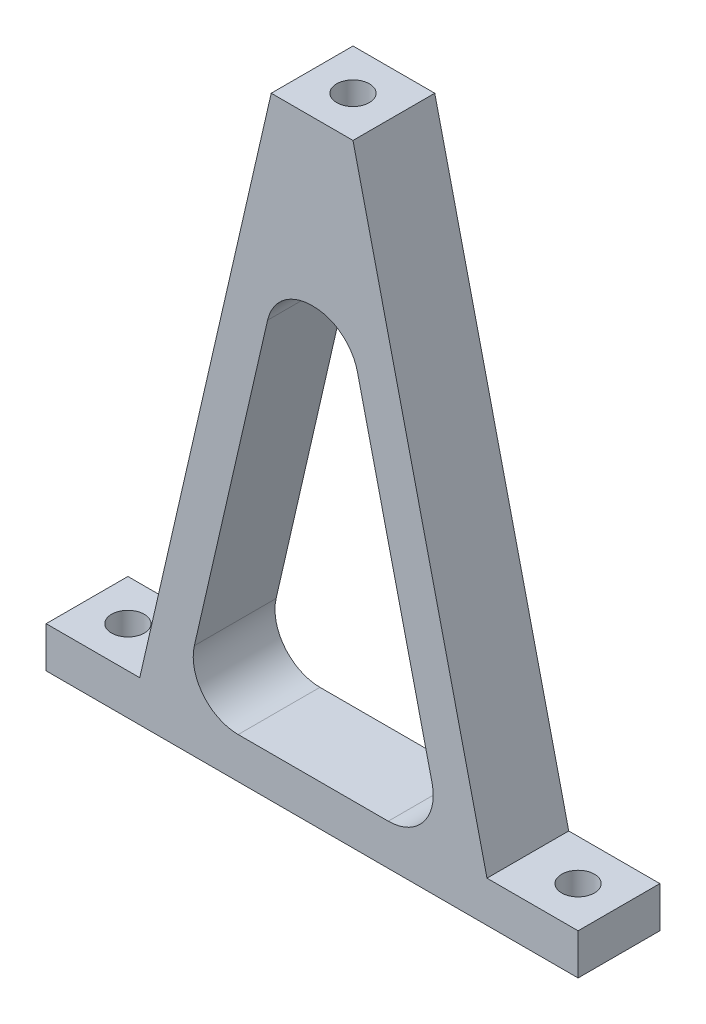
ISO-10303-21;
HEADER;
FILE_DESCRIPTION(('STEP AP214'),'2;1');
FILE_NAME('part.step','',(''),(''),'','','');
FILE_SCHEMA(('AUTOMOTIVE_DESIGN { 1 0 10303 214 1 1 1 1 }'));
ENDSEC;
DATA;
#1=APPLICATION_CONTEXT('core data for automotive mechanical design processes');
#2=APPLICATION_PROTOCOL_DEFINITION('international standard','automotive_design',2000,#1);
#3=PRODUCT_CONTEXT('',#1,'mechanical');
#4=PRODUCT('Part','Part','',(#3));
#5=PRODUCT_RELATED_PRODUCT_CATEGORY('part','',(#4));
#6=PRODUCT_DEFINITION_FORMATION('','',#4);
#7=PRODUCT_DEFINITION_CONTEXT('part definition',#1,'design');
#8=PRODUCT_DEFINITION('design','',#6,#7);
#9=PRODUCT_DEFINITION_SHAPE('','',#8);
#10=(LENGTH_UNIT() NAMED_UNIT(*) SI_UNIT(.MILLI.,.METRE.));
#11=(NAMED_UNIT(*) PLANE_ANGLE_UNIT() SI_UNIT($,.RADIAN.));
#12=(NAMED_UNIT(*) SI_UNIT($,.STERADIAN.) SOLID_ANGLE_UNIT());
#13=UNCERTAINTY_MEASURE_WITH_UNIT(LENGTH_MEASURE(1.E-05),#10,'distance_accuracy_value','');
#14=(GEOMETRIC_REPRESENTATION_CONTEXT(3) GLOBAL_UNCERTAINTY_ASSIGNED_CONTEXT((#13)) GLOBAL_UNIT_ASSIGNED_CONTEXT((#10,
#11,#12)) REPRESENTATION_CONTEXT('',''));
#15=CARTESIAN_POINT('',(0.,0.,0.));
#16=DIRECTION('',(0.,0.,1.));
#17=DIRECTION('',(1.,0.,0.));
#18=AXIS2_PLACEMENT_3D('',#15,#16,#17);
#19=CARTESIAN_POINT('',(-4.46772568231821,4.94396234763485,3.001));
#20=DIRECTION('',(0.,-1.,0.));
#21=DIRECTION('',(0.,0.,-1.));
#22=AXIS2_PLACEMENT_3D('',#19,#20,#21);
#23=PLANE('',#22);
#24=CARTESIAN_POINT('',(0.,4.94396234763485,-2.));
#25=DIRECTION('',(0.,-1.,0.));
#26=DIRECTION('',(0.,0.,-1.));
#27=AXIS2_PLACEMENT_3D('',#24,#25,#26);
#28=CIRCLE('',#27,2.);
#29=CARTESIAN_POINT('',(-0.0887346144552246,4.94396234763485,-0.00196942761190909));
#30=VERTEX_POINT('',#29);
#31=CARTESIAN_POINT('',(0.188894102782161,4.94396234763485,-0.00894022743310819));
#32=VERTEX_POINT('',#31);
#33=EDGE_CURVE('E159',#30,#32,#28,.F.);
#34=ORIENTED_EDGE('',*,*,#33,.T.);
#35=DIRECTION('',(0.,0.,-1.));
#36=VECTOR('',#35,1.);
#37=CARTESIAN_POINT('',(0.188894102782161,4.94396234763485,3.));
#38=LINE('',#37,#36);
#39=CARTESIAN_POINT('',(0.188894102782161,4.94396234763485,3.));
#40=VERTEX_POINT('',#39);
#41=EDGE_CURVE('E170',#32,#40,#38,.F.);
#42=ORIENTED_EDGE('',*,*,#41,.T.);
#43=DIRECTION('',(-1.,0.,0.));
#44=VECTOR('',#43,1.);
#45=CARTESIAN_POINT('',(-4.46772568231821,4.94396234763485,3.));
#46=LINE('',#45,#44);
#47=CARTESIAN_POINT('',(-0.0887346144552246,4.94396234763485,3.));
#48=VERTEX_POINT('',#47);
#49=EDGE_CURVE('E204',#40,#48,#46,.T.);
#50=ORIENTED_EDGE('',*,*,#49,.T.);
#51=DIRECTION('',(0.,0.,-1.));
#52=VECTOR('',#51,1.);
#53=CARTESIAN_POINT('',(-0.0887346144552246,4.94396234763485,-7.));
#54=LINE('',#53,#52);
#55=EDGE_CURVE('E173',#48,#30,#54,.T.);
#56=ORIENTED_EDGE('',*,*,#55,.T.);
#57=EDGE_LOOP('',(#34,#42,#50,#56));
#58=FACE_BOUND('',#57,.T.);
#59=ADVANCED_FACE('F35',(#58),#23,.T.);
#60=CARTESIAN_POINT('',(0.,0.,-7.));
#61=DIRECTION('',(0.,0.,1.));
#62=DIRECTION('',(1.,0.,0.));
#63=AXIS2_PLACEMENT_3D('',#60,#61,#62);
#64=PLANE('',#63);
#65=DIRECTION('',(0.228066186812437,-0.973645630829222,0.));
#66=VECTOR('',#65,1.);
#67=CARTESIAN_POINT('',(10.2788767532947,2.40771811797932,-7.));
#68=LINE('',#67,#66);
#69=CARTESIAN_POINT('',(5.,24.9439623476349,-7.));
#70=VERTEX_POINT('',#69);
#71=CARTESIAN_POINT('',(21.3836330982065,-45.,-7.));
#72=VERTEX_POINT('',#71);
#73=EDGE_CURVE('E263',#70,#72,#68,.T.);
#74=ORIENTED_EDGE('',*,*,#73,.T.);
#75=DIRECTION('',(1.,0.,0.));
#76=VECTOR('',#75,1.);
#77=CARTESIAN_POINT('',(0.,-45.,-7.));
#78=LINE('',#77,#76);
#79=CARTESIAN_POINT('',(32.5277614356054,-45.,-7.));
#80=VERTEX_POINT('',#79);
#81=EDGE_CURVE('E319',#72,#80,#78,.T.);
#82=ORIENTED_EDGE('',*,*,#81,.T.);
#83=DIRECTION('',(0.,-1.,0.));
#84=VECTOR('',#83,1.);
#85=CARTESIAN_POINT('',(32.5277614356054,0.,-7.));
#86=LINE('',#85,#84);
#87=CARTESIAN_POINT('',(32.5277614356054,-50.,-7.));
#88=VERTEX_POINT('',#87);
#89=EDGE_CURVE('E333',#80,#88,#86,.T.);
#90=ORIENTED_EDGE('',*,*,#89,.T.);
#91=DIRECTION('',(1.,0.,0.));
#92=VECTOR('',#91,1.);
#93=CARTESIAN_POINT('',(0.,-50.,-7.));
#94=LINE('',#93,#92);
#95=CARTESIAN_POINT('',(-32.5277614356054,-50.,-7.));
#96=VERTEX_POINT('',#95);
#97=EDGE_CURVE('E330',#96,#88,#94,.T.);
#98=ORIENTED_EDGE('',*,*,#97,.F.);
#99=DIRECTION('',(0.,-1.,0.));
#100=VECTOR('',#99,1.);
#101=CARTESIAN_POINT('',(-32.5277614356054,0.,-7.));
#102=LINE('',#101,#100);
#103=CARTESIAN_POINT('',(-32.5277614356054,-45.,-7.));
#104=VERTEX_POINT('',#103);
#105=EDGE_CURVE('E327',#104,#96,#102,.T.);
#106=ORIENTED_EDGE('',*,*,#105,.F.);
#107=CARTESIAN_POINT('',(-21.0807075183779,-45.,-7.));
#108=VERTEX_POINT('',#107);
#109=EDGE_CURVE('E324',#104,#108,#78,.T.);
#110=ORIENTED_EDGE('',*,*,#109,.T.);
#111=DIRECTION('',(-0.224062946507409,-0.974574674410544,0.));
#112=VECTOR('',#111,1.);
#113=CARTESIAN_POINT('',(-10.1958940864153,2.34412213990829,-7.));
#114=LINE('',#113,#112);
#115=CARTESIAN_POINT('',(-5.,24.9439623476349,-7.));
#116=VERTEX_POINT('',#115);
#117=EDGE_CURVE('E277',#116,#108,#114,.T.);
#118=ORIENTED_EDGE('',*,*,#117,.F.);
#119=DIRECTION('',(1.,0.,0.));
#120=VECTOR('',#119,1.);
#121=CARTESIAN_POINT('',(0.,24.9439623476349,-7.));
#122=LINE('',#121,#120);
#123=EDGE_CURVE('E251',#116,#70,#122,.T.);
#124=ORIENTED_EDGE('',*,*,#123,.T.);
#125=EDGE_LOOP('',(#74,#82,#90,#98,#106,#110,#118,#124));
#126=FACE_BOUND('',#125,.T.);
#127=DIRECTION('',(0.224062946507409,0.974574674410544,0.));
#128=VECTOR('',#127,1.);
#129=CARTESIAN_POINT('',(-4.46772568231821,4.94396234763485,-7.));
#130=LINE('',#129,#128);
#131=CARTESIAN_POINT('',(-14.4024410923454,-38.2676537942093,-7.));
#132=VERTEX_POINT('',#131);
#133=CARTESIAN_POINT('',(-5.44889532371322,0.676308553425599,-7.));
#134=VERTEX_POINT('',#133);
#135=EDGE_CURVE('E297',#132,#134,#130,.T.);
#136=ORIENTED_EDGE('',*,*,#135,.F.);
#137=CARTESIAN_POINT('',(-9.04228038308744,-39.5,-7.));
#138=DIRECTION('',(0.,0.,1.));
#139=DIRECTION('',(1.,0.,0.));
#140=AXIS2_PLACEMENT_3D('',#137,#138,#139);
#141=CIRCLE('',#140,5.5);
#142=CARTESIAN_POINT('',(-9.04228038308744,-45.,-7.));
#143=VERTEX_POINT('',#142);
#144=EDGE_CURVE('E192',#132,#143,#141,.T.);
#145=ORIENTED_EDGE('',*,*,#144,.T.);
#146=DIRECTION('',(-1.,0.,0.));
#147=VECTOR('',#146,1.);
#148=CARTESIAN_POINT('',(-15.9502643298924,-45.,-7.));
#149=LINE('',#148,#147);
#150=CARTESIAN_POINT('',(9.31110521405462,-45.,-7.));
#151=VERTEX_POINT('',#150);
#152=EDGE_CURVE('E300',#151,#143,#149,.T.);
#153=ORIENTED_EDGE('',*,*,#152,.F.);
#154=CARTESIAN_POINT('',(9.31110521405462,-39.5,-7.));
#155=DIRECTION('',(0.,0.,1.));
#156=DIRECTION('',(1.,0.,0.));
#157=AXIS2_PLACEMENT_3D('',#154,#155,#156);
#158=CIRCLE('',#157,5.5);
#159=CARTESIAN_POINT('',(14.6661561836153,-38.2456359725316,-7.));
#160=VERTEX_POINT('',#159);
#161=EDGE_CURVE('E188',#151,#160,#158,.T.);
#162=ORIENTED_EDGE('',*,*,#161,.T.);
#163=DIRECTION('',(0.228066186812437,-0.973645630829222,0.));
#164=VECTOR('',#163,1.);
#165=CARTESIAN_POINT('',(4.54944976913453,4.94396234763485,-7.));
#166=LINE('',#165,#164);
#167=CARTESIAN_POINT('',(5.54394507234289,0.698326375103257,-7.));
#168=VERTEX_POINT('',#167);
#169=EDGE_CURVE('E214',#168,#160,#166,.T.);
#170=ORIENTED_EDGE('',*,*,#169,.F.);
#171=CARTESIAN_POINT('',(0.188894102782161,-0.556037652365148,-7.));
#172=DIRECTION('',(0.,0.,1.));
#173=DIRECTION('',(1.,0.,0.));
#174=AXIS2_PLACEMENT_3D('',#171,#172,#173);
#175=CIRCLE('',#174,5.5);
#176=CARTESIAN_POINT('',(0.188894102782161,4.94396234763485,-7.));
#177=VERTEX_POINT('',#176);
#178=EDGE_CURVE('E43',#168,#177,#175,.T.);
#179=ORIENTED_EDGE('',*,*,#178,.T.);
#180=DIRECTION('',(1.,0.,0.));
#181=VECTOR('',#180,1.);
#182=CARTESIAN_POINT('',(-4.46772568231821,4.94396234763485,-7.));
#183=LINE('',#182,#181);
#184=CARTESIAN_POINT('',(-0.0887346144552246,4.94396234763485,-7.));
#185=VERTEX_POINT('',#184);
#186=EDGE_CURVE('E217',#185,#177,#183,.T.);
#187=ORIENTED_EDGE('',*,*,#186,.F.);
#188=CARTESIAN_POINT('',(-0.0887346144552246,-0.556037652365148,-7.));
#189=DIRECTION('',(0.,0.,1.));
#190=DIRECTION('',(1.,0.,0.));
#191=AXIS2_PLACEMENT_3D('',#188,#189,#190);
#192=CIRCLE('',#191,5.5);
#193=EDGE_CURVE('E196',#185,#134,#192,.T.);
#194=ORIENTED_EDGE('',*,*,#193,.T.);
#195=EDGE_LOOP('',(#136,#145,#153,#162,#170,#179,#187,#194));
#196=FACE_BOUND('',#195,.T.);
#197=ADVANCED_FACE('F298',(#126,#196),#64,.F.);
#198=CARTESIAN_POINT('',(0.,0.,3.));
#199=DIRECTION('',(0.,0.,1.));
#200=DIRECTION('',(1.,0.,0.));
#201=AXIS2_PLACEMENT_3D('',#198,#199,#200);
#202=PLANE('',#201);
#203=DIRECTION('',(0.228066186812437,-0.973645630829222,0.));
#204=VECTOR('',#203,1.);
#205=CARTESIAN_POINT('',(10.2788767532947,2.40771811797932,3.));
#206=LINE('',#205,#204);
#207=CARTESIAN_POINT('',(5.,24.9439623476349,3.));
#208=VERTEX_POINT('',#207);
#209=CARTESIAN_POINT('',(21.3836330982065,-45.,3.));
#210=VERTEX_POINT('',#209);
#211=EDGE_CURVE('E268',#208,#210,#206,.T.);
#212=ORIENTED_EDGE('',*,*,#211,.F.);
#213=DIRECTION('',(1.,0.,0.));
#214=VECTOR('',#213,1.);
#215=CARTESIAN_POINT('',(0.,24.9439623476349,3.));
#216=LINE('',#215,#214);
#217=CARTESIAN_POINT('',(-5.,24.9439623476349,3.));
#218=VERTEX_POINT('',#217);
#219=EDGE_CURVE('E250',#218,#208,#216,.T.);
#220=ORIENTED_EDGE('',*,*,#219,.F.);
#221=DIRECTION('',(-0.224062946507409,-0.974574674410544,0.));
#222=VECTOR('',#221,1.);
#223=CARTESIAN_POINT('',(-10.1958940864153,2.34412213990829,3.));
#224=LINE('',#223,#222);
#225=CARTESIAN_POINT('',(-21.0807075183779,-45.,3.));
#226=VERTEX_POINT('',#225);
#227=EDGE_CURVE('E260',#218,#226,#224,.T.);
#228=ORIENTED_EDGE('',*,*,#227,.T.);
#229=DIRECTION('',(1.,0.,0.));
#230=VECTOR('',#229,1.);
#231=CARTESIAN_POINT('',(0.,-45.,3.));
#232=LINE('',#231,#230);
#233=CARTESIAN_POINT('',(-32.5277614356054,-45.,3.));
#234=VERTEX_POINT('',#233);
#235=EDGE_CURVE('E337',#234,#226,#232,.T.);
#236=ORIENTED_EDGE('',*,*,#235,.F.);
#237=DIRECTION('',(0.,-1.,0.));
#238=VECTOR('',#237,1.);
#239=CARTESIAN_POINT('',(-32.5277614356054,0.,3.));
#240=LINE('',#239,#238);
#241=CARTESIAN_POINT('',(-32.5277614356054,-50.,3.));
#242=VERTEX_POINT('',#241);
#243=EDGE_CURVE('E339',#234,#242,#240,.T.);
#244=ORIENTED_EDGE('',*,*,#243,.T.);
#245=DIRECTION('',(1.,0.,0.));
#246=VECTOR('',#245,1.);
#247=CARTESIAN_POINT('',(0.,-50.,3.));
#248=LINE('',#247,#246);
#249=CARTESIAN_POINT('',(32.5277614356054,-50.,3.));
#250=VERTEX_POINT('',#249);
#251=EDGE_CURVE('E341',#242,#250,#248,.T.);
#252=ORIENTED_EDGE('',*,*,#251,.T.);
#253=DIRECTION('',(0.,-1.,0.));
#254=VECTOR('',#253,1.);
#255=CARTESIAN_POINT('',(32.5277614356054,0.,3.));
#256=LINE('',#255,#254);
#257=CARTESIAN_POINT('',(32.5277614356054,-45.,3.));
#258=VERTEX_POINT('',#257);
#259=EDGE_CURVE('E343',#258,#250,#256,.T.);
#260=ORIENTED_EDGE('',*,*,#259,.F.);
#261=EDGE_CURVE('E336',#210,#258,#232,.T.);
#262=ORIENTED_EDGE('',*,*,#261,.F.);
#263=EDGE_LOOP('',(#212,#220,#228,#236,#244,#252,#260,#262));
#264=FACE_BOUND('',#263,.T.);
#265=DIRECTION('',(1.,0.,0.));
#266=VECTOR('',#265,1.);
#267=CARTESIAN_POINT('',(-15.9502643298924,-45.,3.));
#268=LINE('',#267,#266);
#269=CARTESIAN_POINT('',(-9.04228038308744,-45.,3.));
#270=VERTEX_POINT('',#269);
#271=CARTESIAN_POINT('',(9.31110521405462,-45.,3.));
#272=VERTEX_POINT('',#271);
#273=EDGE_CURVE('E308',#270,#272,#268,.T.);
#274=ORIENTED_EDGE('',*,*,#273,.F.);
#275=CARTESIAN_POINT('',(-9.04228038308744,-39.5,3.));
#276=DIRECTION('',(0.,0.,1.));
#277=DIRECTION('',(1.,0.,0.));
#278=AXIS2_PLACEMENT_3D('',#275,#276,#277);
#279=CIRCLE('',#278,5.5);
#280=CARTESIAN_POINT('',(-14.4024410923454,-38.2676537942093,3.));
#281=VERTEX_POINT('',#280);
#282=EDGE_CURVE('E194',#270,#281,#279,.F.);
#283=ORIENTED_EDGE('',*,*,#282,.T.);
#284=DIRECTION('',(-0.224062946507409,-0.974574674410544,0.));
#285=VECTOR('',#284,1.);
#286=CARTESIAN_POINT('',(-4.46772568231821,4.94396234763485,3.));
#287=LINE('',#286,#285);
#288=CARTESIAN_POINT('',(-5.44889532371322,0.676308553425598,3.));
#289=VERTEX_POINT('',#288);
#290=EDGE_CURVE('E206',#289,#281,#287,.T.);
#291=ORIENTED_EDGE('',*,*,#290,.F.);
#292=CARTESIAN_POINT('',(-0.0887346144552246,-0.556037652365148,3.));
#293=DIRECTION('',(0.,0.,1.));
#294=DIRECTION('',(1.,0.,0.));
#295=AXIS2_PLACEMENT_3D('',#292,#293,#294);
#296=CIRCLE('',#295,5.5);
#297=EDGE_CURVE('E198',#289,#48,#296,.F.);
#298=ORIENTED_EDGE('',*,*,#297,.T.);
#299=ORIENTED_EDGE('',*,*,#49,.F.);
#300=CARTESIAN_POINT('',(0.188894102782161,-0.556037652365148,3.));
#301=DIRECTION('',(0.,0.,1.));
#302=DIRECTION('',(1.,0.,0.));
#303=AXIS2_PLACEMENT_3D('',#300,#301,#302);
#304=CIRCLE('',#303,5.5);
#305=CARTESIAN_POINT('',(5.54394507234289,0.698326375103256,3.));
#306=VERTEX_POINT('',#305);
#307=EDGE_CURVE('E11',#40,#306,#304,.F.);
#308=ORIENTED_EDGE('',*,*,#307,.T.);
#309=DIRECTION('',(-0.228066186812437,0.973645630829223,0.));
#310=VECTOR('',#309,1.);
#311=CARTESIAN_POINT('',(4.54944976913453,4.94396234763485,3.));
#312=LINE('',#311,#310);
#313=CARTESIAN_POINT('',(14.6661561836153,-38.2456359725316,3.));
#314=VERTEX_POINT('',#313);
#315=EDGE_CURVE('E305',#314,#306,#312,.T.);
#316=ORIENTED_EDGE('',*,*,#315,.F.);
#317=CARTESIAN_POINT('',(9.31110521405462,-39.5,3.));
#318=DIRECTION('',(0.,0.,1.));
#319=DIRECTION('',(1.,0.,0.));
#320=AXIS2_PLACEMENT_3D('',#317,#318,#319);
#321=CIRCLE('',#320,5.5);
#322=EDGE_CURVE('E190',#314,#272,#321,.F.);
#323=ORIENTED_EDGE('',*,*,#322,.T.);
#324=EDGE_LOOP('',(#274,#283,#291,#298,#299,#308,#316,#323));
#325=FACE_BOUND('',#324,.T.);
#326=ADVANCED_FACE('F203',(#264,#325),#202,.T.);
#327=CARTESIAN_POINT('',(10.2788767532947,2.40771811797932,-7.));
#328=DIRECTION('',(-0.973645630829222,-0.228066186812437,0.));
#329=DIRECTION('',(0.228066186812437,-0.973645630829222,0.));
#330=AXIS2_PLACEMENT_3D('',#327,#328,#329);
#331=PLANE('',#330);
#332=DIRECTION('',(0.,0.,1.));
#333=VECTOR('',#332,1.);
#334=CARTESIAN_POINT('',(5.,24.9439623476349,-7.));
#335=LINE('',#334,#333);
#336=EDGE_CURVE('E256',#70,#208,#335,.T.);
#337=ORIENTED_EDGE('',*,*,#336,.T.);
#338=ORIENTED_EDGE('',*,*,#211,.T.);
#339=DIRECTION('',(0.,0.,1.));
#340=VECTOR('',#339,1.);
#341=CARTESIAN_POINT('',(21.3836330982065,-45.,-7.));
#342=LINE('',#341,#340);
#343=EDGE_CURVE('E279',#72,#210,#342,.T.);
#344=ORIENTED_EDGE('',*,*,#343,.F.);
#345=ORIENTED_EDGE('',*,*,#73,.F.);
#346=EDGE_LOOP('',(#337,#338,#344,#345));
#347=FACE_BOUND('',#346,.T.);
#348=ADVANCED_FACE('F375',(#347),#331,.F.);
#349=CARTESIAN_POINT('',(-10.1958940864153,2.34412213990829,-7.));
#350=DIRECTION('',(-0.974574674410544,0.224062946507409,0.));
#351=DIRECTION('',(-0.224062946507409,-0.974574674410544,0.));
#352=AXIS2_PLACEMENT_3D('',#349,#350,#351);
#353=PLANE('',#352);
#354=DIRECTION('',(0.,0.,1.));
#355=VECTOR('',#354,1.);
#356=CARTESIAN_POINT('',(-21.0807075183779,-45.,-7.));
#357=LINE('',#356,#355);
#358=EDGE_CURVE('E255',#108,#226,#357,.T.);
#359=ORIENTED_EDGE('',*,*,#358,.T.);
#360=ORIENTED_EDGE('',*,*,#227,.F.);
#361=DIRECTION('',(0.,0.,1.));
#362=VECTOR('',#361,1.);
#363=CARTESIAN_POINT('',(-5.,24.9439623476349,-7.));
#364=LINE('',#363,#362);
#365=EDGE_CURVE('E246',#116,#218,#364,.T.);
#366=ORIENTED_EDGE('',*,*,#365,.F.);
#367=ORIENTED_EDGE('',*,*,#117,.T.);
#368=EDGE_LOOP('',(#359,#360,#366,#367));
#369=FACE_BOUND('',#368,.T.);
#370=ADVANCED_FACE('F242',(#369),#353,.T.);
#371=CARTESIAN_POINT('',(0.,24.9439623476349,-7.));
#372=DIRECTION('',(0.,-1.,0.));
#373=DIRECTION('',(0.,0.,-1.));
#374=AXIS2_PLACEMENT_3D('',#371,#372,#373);
#375=PLANE('',#374);
#376=CARTESIAN_POINT('',(0.,24.9439623476349,-2.));
#377=DIRECTION('',(0.,1.,0.));
#378=DIRECTION('',(0.,0.,1.));
#379=AXIS2_PLACEMENT_3D('',#376,#377,#378);
#380=CIRCLE('',#379,2.);
#381=CARTESIAN_POINT('',(0.,24.9439623476349,0.));
#382=VERTEX_POINT('',#381);
#383=EDGE_CURVE('E165',#382,#382,#380,.T.);
#384=ORIENTED_EDGE('',*,*,#383,.F.);
#385=EDGE_LOOP('',(#384));
#386=FACE_BOUND('',#385,.T.);
#387=ORIENTED_EDGE('',*,*,#365,.T.);
#388=ORIENTED_EDGE('',*,*,#219,.T.);
#389=ORIENTED_EDGE('',*,*,#336,.F.);
#390=ORIENTED_EDGE('',*,*,#123,.F.);
#391=EDGE_LOOP('',(#387,#388,#389,#390));
#392=FACE_BOUND('',#391,.T.);
#393=ADVANCED_FACE('F238',(#386,#392),#375,.F.);
#394=CARTESIAN_POINT('',(0.,-45.,3.));
#395=DIRECTION('',(0.,1.,0.));
#396=DIRECTION('',(0.,0.,1.));
#397=AXIS2_PLACEMENT_3D('',#394,#395,#396);
#398=PLANE('',#397);
#399=CARTESIAN_POINT('',(-27.5277614356054,-45.,-2.));
#400=DIRECTION('',(0.,1.,0.));
#401=DIRECTION('',(0.,0.,1.));
#402=AXIS2_PLACEMENT_3D('',#399,#400,#401);
#403=CIRCLE('',#402,2.);
#404=CARTESIAN_POINT('',(-27.5277614356054,-45.,0.));
#405=VERTEX_POINT('',#404);
#406=EDGE_CURVE('E312',#405,#405,#403,.T.);
#407=ORIENTED_EDGE('',*,*,#406,.F.);
#408=EDGE_LOOP('',(#407));
#409=FACE_BOUND('',#408,.T.);
#410=ORIENTED_EDGE('',*,*,#358,.F.);
#411=ORIENTED_EDGE('',*,*,#109,.F.);
#412=DIRECTION('',(0.,0.,-1.));
#413=VECTOR('',#412,1.);
#414=CARTESIAN_POINT('',(-32.5277614356054,-45.,3.));
#415=LINE('',#414,#413);
#416=EDGE_CURVE('E270',#234,#104,#415,.T.);
#417=ORIENTED_EDGE('',*,*,#416,.F.);
#418=ORIENTED_EDGE('',*,*,#235,.T.);
#419=EDGE_LOOP('',(#410,#411,#417,#418));
#420=FACE_BOUND('',#419,.T.);
#421=ADVANCED_FACE('F241',(#409,#420),#398,.T.);
#422=CARTESIAN_POINT('',(27.5277614356054,-45.,-2.));
#423=DIRECTION('',(0.,1.,0.));
#424=DIRECTION('',(0.,0.,1.));
#425=AXIS2_PLACEMENT_3D('',#422,#423,#424);
#426=CIRCLE('',#425,2.);
#427=CARTESIAN_POINT('',(27.5277614356054,-45.,0.));
#428=VERTEX_POINT('',#427);
#429=EDGE_CURVE('E209',#428,#428,#426,.T.);
#430=ORIENTED_EDGE('',*,*,#429,.F.);
#431=EDGE_LOOP('',(#430));
#432=FACE_BOUND('',#431,.T.);
#433=ORIENTED_EDGE('',*,*,#81,.F.);
#434=ORIENTED_EDGE('',*,*,#343,.T.);
#435=ORIENTED_EDGE('',*,*,#261,.T.);
#436=DIRECTION('',(0.,0.,-1.));
#437=VECTOR('',#436,1.);
#438=CARTESIAN_POINT('',(32.5277614356054,-45.,3.));
#439=LINE('',#438,#437);
#440=EDGE_CURVE('E346',#258,#80,#439,.T.);
#441=ORIENTED_EDGE('',*,*,#440,.T.);
#442=EDGE_LOOP('',(#433,#434,#435,#441));
#443=FACE_BOUND('',#442,.T.);
#444=ADVANCED_FACE('F371',(#432,#443),#398,.T.);
#445=CARTESIAN_POINT('',(-32.5277614356054,0.,3.));
#446=DIRECTION('',(1.,0.,0.));
#447=DIRECTION('',(0.,0.,-1.));
#448=AXIS2_PLACEMENT_3D('',#445,#446,#447);
#449=PLANE('',#448);
#450=ORIENTED_EDGE('',*,*,#416,.T.);
#451=ORIENTED_EDGE('',*,*,#105,.T.);
#452=DIRECTION('',(0.,0.,-1.));
#453=VECTOR('',#452,1.);
#454=CARTESIAN_POINT('',(-32.5277614356054,-50.,3.));
#455=LINE('',#454,#453);
#456=EDGE_CURVE('E351',#242,#96,#455,.T.);
#457=ORIENTED_EDGE('',*,*,#456,.F.);
#458=ORIENTED_EDGE('',*,*,#243,.F.);
#459=EDGE_LOOP('',(#450,#451,#457,#458));
#460=FACE_BOUND('',#459,.T.);
#461=ADVANCED_FACE('F355',(#460),#449,.F.);
#462=CARTESIAN_POINT('',(0.,-50.,3.));
#463=DIRECTION('',(0.,1.,0.));
#464=DIRECTION('',(0.,0.,1.));
#465=AXIS2_PLACEMENT_3D('',#462,#463,#464);
#466=PLANE('',#465);
#467=CARTESIAN_POINT('',(-27.5277614356054,-50.,-2.));
#468=DIRECTION('',(0.,1.,0.));
#469=DIRECTION('',(0.,0.,1.));
#470=AXIS2_PLACEMENT_3D('',#467,#468,#469);
#471=CIRCLE('',#470,2.);
#472=CARTESIAN_POINT('',(-27.5277614356054,-50.,0.));
#473=VERTEX_POINT('',#472);
#474=EDGE_CURVE('E315',#473,#473,#471,.F.);
#475=ORIENTED_EDGE('',*,*,#474,.F.);
#476=EDGE_LOOP('',(#475));
#477=FACE_BOUND('',#476,.T.);
#478=CARTESIAN_POINT('',(27.5277614356054,-50.,-2.));
#479=DIRECTION('',(0.,1.,0.));
#480=DIRECTION('',(0.,0.,1.));
#481=AXIS2_PLACEMENT_3D('',#478,#479,#480);
#482=CIRCLE('',#481,2.);
#483=CARTESIAN_POINT('',(27.5277614356054,-50.,0.));
#484=VERTEX_POINT('',#483);
#485=EDGE_CURVE('E316',#484,#484,#482,.F.);
#486=ORIENTED_EDGE('',*,*,#485,.F.);
#487=EDGE_LOOP('',(#486));
#488=FACE_BOUND('',#487,.T.);
#489=ORIENTED_EDGE('',*,*,#456,.T.);
#490=ORIENTED_EDGE('',*,*,#97,.T.);
#491=DIRECTION('',(0.,0.,-1.));
#492=VECTOR('',#491,1.);
#493=CARTESIAN_POINT('',(32.5277614356054,-50.,3.));
#494=LINE('',#493,#492);
#495=EDGE_CURVE('E349',#250,#88,#494,.T.);
#496=ORIENTED_EDGE('',*,*,#495,.F.);
#497=ORIENTED_EDGE('',*,*,#251,.F.);
#498=EDGE_LOOP('',(#489,#490,#496,#497));
#499=FACE_BOUND('',#498,.T.);
#500=ADVANCED_FACE('F364',(#477,#488,#499),#466,.F.);
#501=CARTESIAN_POINT('',(32.5277614356054,0.,3.));
#502=DIRECTION('',(1.,0.,0.));
#503=DIRECTION('',(0.,0.,-1.));
#504=AXIS2_PLACEMENT_3D('',#501,#502,#503);
#505=PLANE('',#504);
#506=ORIENTED_EDGE('',*,*,#495,.T.);
#507=ORIENTED_EDGE('',*,*,#89,.F.);
#508=ORIENTED_EDGE('',*,*,#440,.F.);
#509=ORIENTED_EDGE('',*,*,#259,.T.);
#510=EDGE_LOOP('',(#506,#507,#508,#509));
#511=FACE_BOUND('',#510,.T.);
#512=ADVANCED_FACE('F369',(#511),#505,.T.);
#513=CARTESIAN_POINT('',(27.5277614356054,-50.001,-2.));
#514=DIRECTION('',(0.,1.,0.));
#515=DIRECTION('',(0.,0.,1.));
#516=AXIS2_PLACEMENT_3D('',#513,#514,#515);
#517=CYLINDRICAL_SURFACE('',#516,2.);
#518=ORIENTED_EDGE('',*,*,#429,.T.);
#519=EDGE_LOOP('',(#518));
#520=FACE_BOUND('',#519,.T.);
#521=ORIENTED_EDGE('',*,*,#485,.T.);
#522=EDGE_LOOP('',(#521));
#523=FACE_BOUND('',#522,.T.);
#524=ADVANCED_FACE('F507',(#520,#523),#517,.F.);
#525=CARTESIAN_POINT('',(-27.5277614356054,-50.001,-2.));
#526=DIRECTION('',(0.,1.,0.));
#527=DIRECTION('',(0.,0.,1.));
#528=AXIS2_PLACEMENT_3D('',#525,#526,#527);
#529=CYLINDRICAL_SURFACE('',#528,2.);
#530=ORIENTED_EDGE('',*,*,#406,.T.);
#531=EDGE_LOOP('',(#530));
#532=FACE_BOUND('',#531,.T.);
#533=ORIENTED_EDGE('',*,*,#474,.T.);
#534=EDGE_LOOP('',(#533));
#535=FACE_BOUND('',#534,.T.);
#536=ADVANCED_FACE('F483',(#532,#535),#529,.F.);
#537=CARTESIAN_POINT('',(-4.46772568231821,4.94396234763485,3.001));
#538=DIRECTION('',(0.974574674410544,-0.224062946507409,0.));
#539=DIRECTION('',(0.224062946507409,0.974574674410544,0.));
#540=AXIS2_PLACEMENT_3D('',#537,#538,#539);
#541=PLANE('',#540);
#542=ORIENTED_EDGE('',*,*,#290,.T.);
#543=DIRECTION('',(0.,0.,-1.));
#544=VECTOR('',#543,1.);
#545=CARTESIAN_POINT('',(-14.4024410923454,-38.2676537942093,-7.));
#546=LINE('',#545,#544);
#547=EDGE_CURVE('E179',#281,#132,#546,.T.);
#548=ORIENTED_EDGE('',*,*,#547,.T.);
#549=ORIENTED_EDGE('',*,*,#135,.T.);
#550=DIRECTION('',(0.,0.,-1.));
#551=VECTOR('',#550,1.);
#552=CARTESIAN_POINT('',(-5.44889532371322,0.6763085534256,3.));
#553=LINE('',#552,#551);
#554=EDGE_CURVE('E183',#134,#289,#553,.F.);
#555=ORIENTED_EDGE('',*,*,#554,.T.);
#556=EDGE_LOOP('',(#542,#548,#549,#555));
#557=FACE_BOUND('',#556,.T.);
#558=ADVANCED_FACE('F294',(#557),#541,.T.);
#559=CARTESIAN_POINT('',(-15.9502643298924,-45.,3.001));
#560=DIRECTION('',(0.,1.,0.));
#561=DIRECTION('',(0.,0.,1.));
#562=AXIS2_PLACEMENT_3D('',#559,#560,#561);
#563=PLANE('',#562);
#564=ORIENTED_EDGE('',*,*,#273,.T.);
#565=DIRECTION('',(0.,0.,-1.));
#566=VECTOR('',#565,1.);
#567=CARTESIAN_POINT('',(9.31110521405462,-45.,-7.));
#568=LINE('',#567,#566);
#569=EDGE_CURVE('E285',#272,#151,#568,.T.);
#570=ORIENTED_EDGE('',*,*,#569,.T.);
#571=ORIENTED_EDGE('',*,*,#152,.T.);
#572=DIRECTION('',(0.,0.,-1.));
#573=VECTOR('',#572,1.);
#574=CARTESIAN_POINT('',(-9.04228038308744,-45.,3.));
#575=LINE('',#574,#573);
#576=EDGE_CURVE('E281',#143,#270,#575,.F.);
#577=ORIENTED_EDGE('',*,*,#576,.T.);
#578=EDGE_LOOP('',(#564,#570,#571,#577));
#579=FACE_BOUND('',#578,.T.);
#580=ADVANCED_FACE('F401',(#579),#563,.T.);
#581=CARTESIAN_POINT('',(4.54944976913453,4.94396234763485,3.001));
#582=DIRECTION('',(-0.973645630829223,-0.228066186812437,0.));
#583=DIRECTION('',(0.228066186812437,-0.973645630829223,0.));
#584=AXIS2_PLACEMENT_3D('',#581,#582,#583);
#585=PLANE('',#584);
#586=ORIENTED_EDGE('',*,*,#169,.T.);
#587=DIRECTION('',(0.,0.,-1.));
#588=VECTOR('',#587,1.);
#589=CARTESIAN_POINT('',(14.6661561836153,-38.2456359725316,3.));
#590=LINE('',#589,#588);
#591=EDGE_CURVE('E291',#160,#314,#590,.F.);
#592=ORIENTED_EDGE('',*,*,#591,.T.);
#593=ORIENTED_EDGE('',*,*,#315,.T.);
#594=DIRECTION('',(0.,0.,-1.));
#595=VECTOR('',#594,1.);
#596=CARTESIAN_POINT('',(5.54394507234289,0.698326375103257,-7.));
#597=LINE('',#596,#595);
#598=EDGE_CURVE('E288',#306,#168,#597,.T.);
#599=ORIENTED_EDGE('',*,*,#598,.T.);
#600=EDGE_LOOP('',(#586,#592,#593,#599));
#601=FACE_BOUND('',#600,.T.);
#602=ADVANCED_FACE('F394',(#601),#585,.T.);
#603=CARTESIAN_POINT('',(0.188894102782161,4.94396234763485,-3.99105977256689));
#604=VERTEX_POINT('',#603);
#605=CARTESIAN_POINT('',(-0.0887346144552246,4.94396234763485,-3.99803057238809));
#606=VERTEX_POINT('',#605);
#607=EDGE_CURVE('E50',#604,#606,#28,.F.);
#608=ORIENTED_EDGE('',*,*,#607,.T.);
#609=EDGE_CURVE('E181',#606,#185,#54,.T.);
#610=ORIENTED_EDGE('',*,*,#609,.T.);
#611=ORIENTED_EDGE('',*,*,#186,.T.);
#612=EDGE_CURVE('E178',#177,#604,#38,.F.);
#613=ORIENTED_EDGE('',*,*,#612,.T.);
#614=EDGE_LOOP('',(#608,#610,#611,#613));
#615=FACE_BOUND('',#614,.T.);
#616=ADVANCED_FACE('F386',(#615),#23,.T.);
#617=CARTESIAN_POINT('',(9.31110521405462,-39.5,3.001));
#618=DIRECTION('',(0.,0.,1.));
#619=DIRECTION('',(1.,0.,0.));
#620=AXIS2_PLACEMENT_3D('',#617,#618,#619);
#621=CYLINDRICAL_SURFACE('',#620,5.5);
#622=ORIENTED_EDGE('',*,*,#322,.F.);
#623=ORIENTED_EDGE('',*,*,#591,.F.);
#624=ORIENTED_EDGE('',*,*,#161,.F.);
#625=ORIENTED_EDGE('',*,*,#569,.F.);
#626=EDGE_LOOP('',(#622,#623,#624,#625));
#627=FACE_BOUND('',#626,.T.);
#628=ADVANCED_FACE('F393',(#627),#621,.F.);
#629=CARTESIAN_POINT('',(-9.04228038308744,-39.5,3.001));
#630=DIRECTION('',(0.,0.,1.));
#631=DIRECTION('',(1.,0.,0.));
#632=AXIS2_PLACEMENT_3D('',#629,#630,#631);
#633=CYLINDRICAL_SURFACE('',#632,5.5);
#634=ORIENTED_EDGE('',*,*,#282,.F.);
#635=ORIENTED_EDGE('',*,*,#576,.F.);
#636=ORIENTED_EDGE('',*,*,#144,.F.);
#637=ORIENTED_EDGE('',*,*,#547,.F.);
#638=EDGE_LOOP('',(#634,#635,#636,#637));
#639=FACE_BOUND('',#638,.T.);
#640=ADVANCED_FACE('F399',(#639),#633,.F.);
#641=CARTESIAN_POINT('',(-0.0887346144552246,-0.556037652365148,3.001));
#642=DIRECTION('',(0.,0.,1.));
#643=DIRECTION('',(1.,0.,0.));
#644=AXIS2_PLACEMENT_3D('',#641,#642,#643);
#645=CYLINDRICAL_SURFACE('',#644,5.5);
#646=ORIENTED_EDGE('',*,*,#609,.F.);
#647=CARTESIAN_POINT('',(-0.0887346144552243,4.94396234763485,-0.00196942761190909));
#648=CARTESIAN_POINT('',(-0.143197033058534,4.94396669204299,-0.00438662987612358));
#649=CARTESIAN_POINT('',(-0.197532182049438,4.94315248290741,-0.00903387083339852));
#650=CARTESIAN_POINT('',(-0.30558268712053,4.93995092492464,-0.0227328411783769));
#651=CARTESIAN_POINT('',(-0.359298209910816,4.93756400975587,-0.0317833561700895));
#652=CARTESIAN_POINT('',(-0.518601227338177,4.92816369200214,-0.0653735504778375));
#653=CARTESIAN_POINT('',(-0.622771499479517,4.91890972069995,-0.0963715310555939));
#654=CARTESIAN_POINT('',(-0.824129122094725,4.89552145664748,-0.174489349929603));
#655=CARTESIAN_POINT('',(-0.921320440033511,4.88138996368249,-0.221599939157624));
#656=CARTESIAN_POINT('',(-1.10653988144744,4.84978391304212,-0.330533688949835));
#657=CARTESIAN_POINT('',(-1.1945623129366,4.83230729761147,-0.392365911280898));
#658=CARTESIAN_POINT('',(-1.36237841962174,4.7951762961071,-0.531586433945993));
#659=CARTESIAN_POINT('',(-1.44176102698447,4.77546611235506,-0.609455194137108));
#660=CARTESIAN_POINT('',(-1.58663359970625,4.7365926365702,-0.777342558377179));
#661=CARTESIAN_POINT('',(-1.65212023693246,4.71742947650044,-0.867364064622816));
#662=CARTESIAN_POINT('',(-1.7690899458749,4.68135380443168,-1.06011807113961));
#663=CARTESIAN_POINT('',(-1.82012819002171,4.66451959527716,-1.16313650332132));
#664=CARTESIAN_POINT('',(-1.90395697437543,4.63597036654055,-1.37700401727614));
#665=CARTESIAN_POINT('',(-1.93675549886194,4.62425310754085,-1.48784964877519));
#666=CARTESIAN_POINT('',(-1.98184458091684,4.60794248997018,-1.70928242731712));
#667=CARTESIAN_POINT('',(-1.99493817120687,4.60307075082577,-1.81968512599596));
#668=CARTESIAN_POINT('',(-2.00264231532422,4.60021869692244,-2.04120967171045));
#669=CARTESIAN_POINT('',(-1.99725756652668,4.60223663074038,-2.15233132881161));
#670=CARTESIAN_POINT('',(-1.96890852071393,4.61263233387967,-2.36685134268235));
#671=CARTESIAN_POINT('',(-1.94674830809126,4.62071906360902,-2.47037196025975));
#672=CARTESIAN_POINT('',(-1.88660732855874,4.64191018587596,-2.67216231257733));
#673=CARTESIAN_POINT('',(-1.84862385782851,4.655015435929,-2.77043114667244));
#674=CARTESIAN_POINT('',(-1.75678331697532,4.68514550441679,-2.96192195712647));
#675=CARTESIAN_POINT('',(-1.70252508267273,4.70226665949834,-3.05493583035015));
#676=CARTESIAN_POINT('',(-1.58002446916018,4.73831060213763,-3.23086128291948));
#677=CARTESIAN_POINT('',(-1.51177845503755,4.75723385730962,-3.31377022741509));
#678=CARTESIAN_POINT('',(-1.35877405041733,4.79592966431789,-3.47190075352109));
#679=CARTESIAN_POINT('',(-1.27331290831359,4.81569154536096,-3.54644683337934));
#680=CARTESIAN_POINT('',(-1.09062420789862,4.85274140179208,-3.68028546217692));
#681=CARTESIAN_POINT('',(-0.993391878875327,4.87002836789186,-3.73957179589991));
#682=CARTESIAN_POINT('',(-0.789793459521966,4.90006871080451,-3.84096587984457));
#683=CARTESIAN_POINT('',(-0.683434678499879,4.91282567435265,-3.88308722476492));
#684=CARTESIAN_POINT('',(-0.464697032127275,4.93218872008305,-3.94859567117294));
#685=CARTESIAN_POINT('',(-0.35233293666973,4.93880921938654,-3.97202666594615));
#686=CARTESIAN_POINT('',(-0.213942445131557,4.94259467213887,-3.98868454182778));
#687=CARTESIAN_POINT('',(-0.18893704001986,4.94310701916633,-3.99121506586249));
#688=CARTESIAN_POINT('',(-0.138875984009912,4.94379020800932,-3.99532963226575));
#689=CARTESIAN_POINT('',(-0.113820438185608,4.94396148548804,-3.99691488026046));
#690=CARTESIAN_POINT('',(-0.0887346144552242,4.94396234763485,-3.99803057238809));
#691=B_SPLINE_CURVE_WITH_KNOTS('',3,(#647,#648,#649,#650,#651,#652,#653,#654,#655,#656,#657,
#658,#659,#660,#661,#662,#663,#664,#665,#666,#667,#668,#669,#670,#671,#672,#673,#674,#675,#676,
#677,#678,#679,#680,#681,#682,#683,#684,#685,#686,#687,#688,#689,#690),.UNSPECIFIED.,.F.,.F.,(4,
2,2,2,2,2,2,2,2,2,2,2,2,2,2,2,2,2,2,2,2,4),(0.,0.163441523939136,0.326837997238063,
0.652367690657612,0.977710834081185,1.3032547596218,1.6405351466606,1.97789622256846,
2.32472986566605,2.67141156558695,3.00354132944641,3.3355866689158,3.6526513573023,
3.9697702467793,4.29545747093987,4.62122943685483,4.96495561402753,5.30882156836483,
5.65241464852584,5.99519842335549,6.07060283534328,6.14591086800711),.UNSPECIFIED.);
#692=EDGE_CURVE('E174',#30,#606,#691,.T.);
#693=ORIENTED_EDGE('',*,*,#692,.F.);
#694=ORIENTED_EDGE('',*,*,#55,.F.);
#695=ORIENTED_EDGE('',*,*,#297,.F.);
#696=ORIENTED_EDGE('',*,*,#554,.F.);
#697=ORIENTED_EDGE('',*,*,#193,.F.);
#698=EDGE_LOOP('',(#646,#693,#694,#695,#696,#697));
#699=FACE_BOUND('',#698,.T.);
#700=ADVANCED_FACE('F212',(#699),#645,.F.);
#701=CARTESIAN_POINT('',(0.188894102782161,-0.556037652365148,3.001));
#702=DIRECTION('',(0.,0.,1.));
#703=DIRECTION('',(1.,0.,0.));
#704=AXIS2_PLACEMENT_3D('',#701,#702,#703);
#705=CYLINDRICAL_SURFACE('',#704,5.5);
#706=ORIENTED_EDGE('',*,*,#41,.F.);
#707=CARTESIAN_POINT('',(0.188894102782162,4.94396234763485,-3.99105977256689));
#708=CARTESIAN_POINT('',(0.243331393115561,4.94396666281832,-3.98589675311107));
#709=CARTESIAN_POINT('',(0.29752779645765,4.9431532727137,-3.97849952656863));
#710=CARTESIAN_POINT('',(0.405075016023874,4.93997471652926,-3.95931068817824));
#711=CARTESIAN_POINT('',(0.45842607336472,4.93761000139919,-3.94752035377907));
#712=CARTESIAN_POINT('',(0.616314411909082,4.92833692431242,-3.90576964390068));
#713=CARTESIAN_POINT('',(0.7191034150563,4.91924836155028,-3.86938934038944));
#714=CARTESIAN_POINT('',(0.916870221692594,4.89648349622933,-3.78076000393306));
#715=CARTESIAN_POINT('',(1.01185287617294,4.88281007003174,-3.72852092209521));
#716=CARTESIAN_POINT('',(1.19189566124283,4.85250458194799,-3.60966606864257));
#717=CARTESIAN_POINT('',(1.2769496026823,4.83587069076632,-3.54304140260019));
#718=CARTESIAN_POINT('',(1.43793553941172,4.80091379741891,-3.39454489757245));
#719=CARTESIAN_POINT('',(1.51343872215173,4.78255186901278,-3.31221728045754));
#720=CARTESIAN_POINT('',(1.64981966072883,4.74685561304378,-3.13600583099254));
#721=CARTESIAN_POINT('',(1.71069514466301,4.72952144542223,-3.04212020692929));
#722=CARTESIAN_POINT('',(1.81718493926533,4.69770697071809,-2.84310308284104));
#723=CARTESIAN_POINT('',(1.86247031024794,4.68329054743905,-2.73778448804851));
#724=CARTESIAN_POINT('',(1.93448671366665,4.65974220924977,-2.52043543267438));
#725=CARTESIAN_POINT('',(1.96122571543074,4.6506080248557,-2.40840787742441));
#726=CARTESIAN_POINT('',(1.9943654401513,4.63920719370902,-2.18600200758096));
#727=CARTESIAN_POINT('',(2.0015948282121,4.6366609318062,-2.0757614950974));
#728=CARTESIAN_POINT('',(1.99781697915994,4.63797847439772,-1.85564407053116));
#729=CARTESIAN_POINT('',(1.98681274139695,4.64184122463834,-1.74576710162616));
#730=CARTESIAN_POINT('',(1.94767584671962,4.65520849650318,-1.53325295070518));
#731=CARTESIAN_POINT('',(1.92011893348185,4.66452312118526,-1.43049651149281));
#732=CARTESIAN_POINT('',(1.84930610335568,4.687473421076,-1.23105853480735));
#733=CARTESIAN_POINT('',(1.80604670043736,4.70111005570679,-1.13437835188868));
#734=CARTESIAN_POINT('',(1.70335944145281,4.73162244147253,-0.946225549411869));
#735=CARTESIAN_POINT('',(1.64343319419992,4.74859232638434,-0.855040567430853));
#736=CARTESIAN_POINT('',(1.50968366468767,4.78346459595539,-0.683688606752407));
#737=CARTESIAN_POINT('',(1.43585633154962,4.80136725132812,-0.603524851532522));
#738=CARTESIAN_POINT('',(1.2724474973863,4.83684623236149,-0.452818683910033));
#739=CARTESIAN_POINT('',(1.18230999472759,4.85437234627851,-0.382865244717142));
#740=CARTESIAN_POINT('',(0.991078814100792,4.88600914428637,-0.25910243065663));
#741=CARTESIAN_POINT('',(0.889992105965583,4.90012198284875,-0.205282866863991));
#742=CARTESIAN_POINT('',(0.690527960523238,4.92185780715563,-0.120196656856529));
#743=CARTESIAN_POINT('',(0.592964411447466,4.9300035386387,-0.0871651960813093));
#744=CARTESIAN_POINT('',(0.443459561981967,4.93829666430497,-0.0491014181569396));
#745=CARTESIAN_POINT('',(0.393029888333717,4.94040697400996,-0.0383208338109521));
#746=CARTESIAN_POINT('',(0.291435535511271,4.94324184877236,-0.0206758569232751));
#747=CARTESIAN_POINT('',(0.240270629071676,4.94396597564608,-0.0138127031942909));
#748=CARTESIAN_POINT('',(0.188894102782162,4.94396234763485,-0.00894022743310815));
#749=B_SPLINE_CURVE_WITH_KNOTS('',3,(#707,#708,#709,#710,#711,#712,#713,#714,#715,#716,#717,
#718,#719,#720,#721,#722,#723,#724,#725,#726,#727,#728,#729,#730,#731,#732,#733,#734,#735,#736,
#737,#738,#739,#740,#741,#742,#743,#744,#745,#746,#747,#748),.UNSPECIFIED.,.F.,.F.,(4,2,2,2,2,2,
2,2,2,2,2,2,2,2,2,2,2,2,2,2,4),(0.,0.163936921781855,0.327826210362761,0.654366070609446,
0.980701454811814,1.30723918885651,1.64532146506712,1.98345621667797,2.32834154801135,
2.67307859102645,3.00292389530937,3.33271494689993,3.65165019082074,3.97065628328242,
4.30047655606373,4.63039309006364,4.97503182364129,5.31945244894293,5.62801013791994,
5.78269474820949,5.93742824749432),.UNSPECIFIED.);
#750=EDGE_CURVE('E156',#604,#32,#749,.T.);
#751=ORIENTED_EDGE('',*,*,#750,.F.);
#752=ORIENTED_EDGE('',*,*,#612,.F.);
#753=ORIENTED_EDGE('',*,*,#178,.F.);
#754=ORIENTED_EDGE('',*,*,#598,.F.);
#755=ORIENTED_EDGE('',*,*,#307,.F.);
#756=EDGE_LOOP('',(#706,#751,#752,#753,#754,#755));
#757=FACE_BOUND('',#756,.T.);
#758=ADVANCED_FACE('F37',(#757),#705,.F.);
#759=CARTESIAN_POINT('',(0.,-50.001,-2.));
#760=DIRECTION('',(0.,1.,0.));
#761=DIRECTION('',(0.,0.,1.));
#762=AXIS2_PLACEMENT_3D('',#759,#760,#761);
#763=CYLINDRICAL_SURFACE('',#762,2.);
#764=ORIENTED_EDGE('',*,*,#383,.T.);
#765=EDGE_LOOP('',(#764));
#766=FACE_BOUND('',#765,.T.);
#767=ORIENTED_EDGE('',*,*,#692,.T.);
#768=ORIENTED_EDGE('',*,*,#607,.F.);
#769=ORIENTED_EDGE('',*,*,#750,.T.);
#770=ORIENTED_EDGE('',*,*,#33,.F.);
#771=EDGE_LOOP('',(#767,#768,#769,#770));
#772=FACE_BOUND('',#771,.T.);
#773=ADVANCED_FACE('F158',(#766,#772),#763,.F.);
#774=CLOSED_SHELL('',(#59,#197,#326,#348,#370,#393,#421,#444,#461,#500,#512,#524,#536,#558,#580,
#602,#616,#628,#640,#700,#758,#773));
#775=MANIFOLD_SOLID_BREP('B2',#774);
#776=ADVANCED_BREP_SHAPE_REPRESENTATION('',(#18,#775),#14);
#777=SHAPE_DEFINITION_REPRESENTATION(#9,#776);
ENDSEC;
END-ISO-10303-21;
